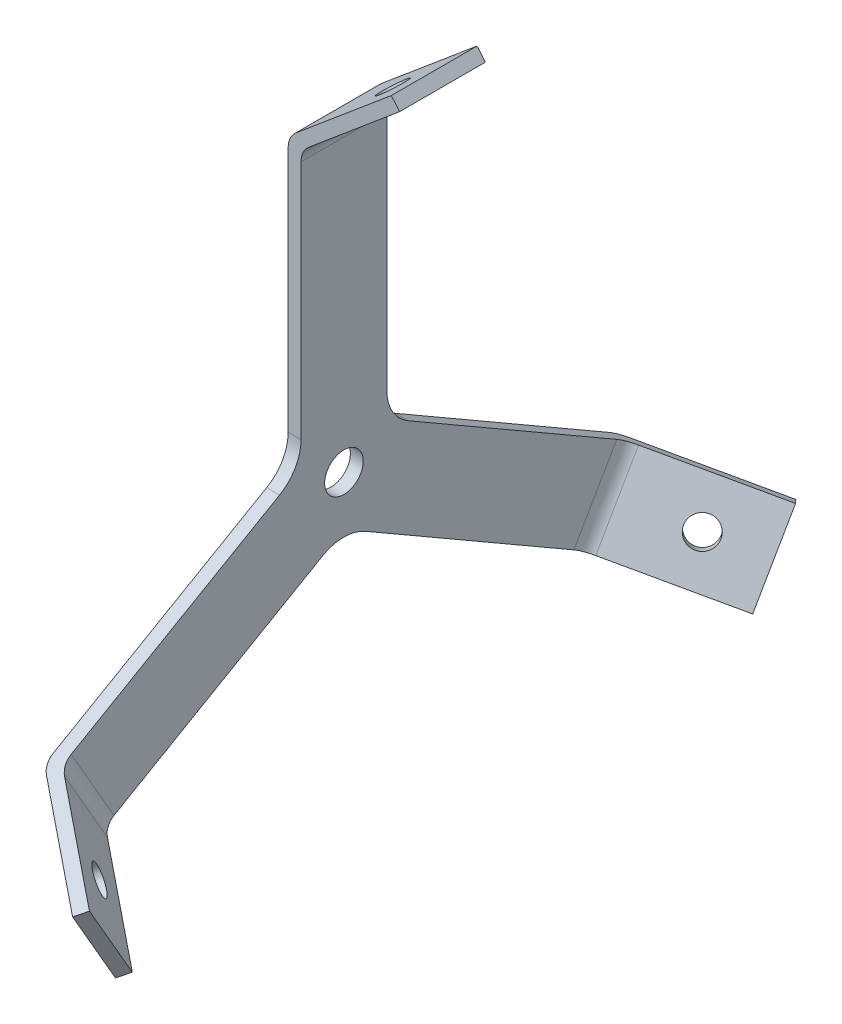
ISO-10303-21;
HEADER;
FILE_DESCRIPTION(('STEP AP214'),'2;1');
FILE_NAME('part.step','',(''),(''),'','','');
FILE_SCHEMA(('AUTOMOTIVE_DESIGN { 1 0 10303 214 1 1 1 1 }'));
ENDSEC;
DATA;
#1=APPLICATION_CONTEXT('core data for automotive mechanical design processes');
#2=APPLICATION_PROTOCOL_DEFINITION('international standard','automotive_design',2000,#1);
#3=PRODUCT_CONTEXT('',#1,'mechanical');
#4=PRODUCT('Part','Part','',(#3));
#5=PRODUCT_RELATED_PRODUCT_CATEGORY('part','',(#4));
#6=PRODUCT_DEFINITION_FORMATION('','',#4);
#7=PRODUCT_DEFINITION_CONTEXT('part definition',#1,'design');
#8=PRODUCT_DEFINITION('design','',#6,#7);
#9=PRODUCT_DEFINITION_SHAPE('','',#8);
#10=(LENGTH_UNIT() NAMED_UNIT(*) SI_UNIT(.MILLI.,.METRE.));
#11=(NAMED_UNIT(*) PLANE_ANGLE_UNIT() SI_UNIT($,.RADIAN.));
#12=(NAMED_UNIT(*) SI_UNIT($,.STERADIAN.) SOLID_ANGLE_UNIT());
#13=UNCERTAINTY_MEASURE_WITH_UNIT(LENGTH_MEASURE(1.E-05),#10,'distance_accuracy_value','');
#14=(GEOMETRIC_REPRESENTATION_CONTEXT(3) GLOBAL_UNCERTAINTY_ASSIGNED_CONTEXT((#13)) GLOBAL_UNIT_ASSIGNED_CONTEXT((#10,
#11,#12)) REPRESENTATION_CONTEXT('',''));
#15=CARTESIAN_POINT('',(0.,0.,0.));
#16=DIRECTION('',(0.,0.,1.));
#17=DIRECTION('',(1.,0.,0.));
#18=AXIS2_PLACEMENT_3D('',#15,#16,#17);
#19=CARTESIAN_POINT('',(5.,69.06738468369,-10.));
#20=DIRECTION('',(0.,0.,-1.));
#21=DIRECTION('',(-1.,0.,0.));
#22=AXIS2_PLACEMENT_3D('',#19,#20,#21);
#23=PLANE('',#22);
#24=DIRECTION('',(0.,1.,0.));
#25=VECTOR('',#24,1.);
#26=CARTESIAN_POINT('',(3.,67.668461709225,-10.));
#27=LINE('',#26,#25);
#28=CARTESIAN_POINT('',(3.,11.5470053837926,-10.));
#29=VERTEX_POINT('',#28);
#30=CARTESIAN_POINT('',(3.00000000000001,67.668461709225,-10.));
#31=VERTEX_POINT('',#30);
#32=EDGE_CURVE('E333',#29,#31,#27,.T.);
#33=ORIENTED_EDGE('',*,*,#32,.F.);
#34=DIRECTION('',(-1.,0.,0.));
#35=VECTOR('',#34,1.);
#36=CARTESIAN_POINT('',(5.,11.5470053837926,-10.));
#37=LINE('',#36,#35);
#38=CARTESIAN_POINT('',(0.,11.5470053837926,-10.));
#39=VERTEX_POINT('',#38);
#40=EDGE_CURVE('E371',#29,#39,#37,.T.);
#41=ORIENTED_EDGE('',*,*,#40,.T.);
#42=DIRECTION('',(0.,-1.,0.));
#43=VECTOR('',#42,1.);
#44=CARTESIAN_POINT('',(0.,0.,-10.));
#45=LINE('',#44,#43);
#46=CARTESIAN_POINT('',(0.,69.06738468369,-10.));
#47=VERTEX_POINT('',#46);
#48=EDGE_CURVE('E350',#47,#39,#45,.T.);
#49=ORIENTED_EDGE('',*,*,#48,.F.);
#50=CARTESIAN_POINT('',(5.,69.06738468369,-10.));
#51=DIRECTION('',(0.,0.,1.));
#52=DIRECTION('',(-1.,0.,0.));
#53=AXIS2_PLACEMENT_3D('',#50,#51,#52);
#54=CIRCLE('',#53,5.);
#55=CARTESIAN_POINT('',(1.78606195156731,72.8976068992849,-10.));
#56=VERTEX_POINT('',#55);
#57=EDGE_CURVE('E347',#56,#47,#54,.T.);
#58=ORIENTED_EDGE('',*,*,#57,.F.);
#59=DIRECTION('',(-0.766044443118979,-0.642787609686539,0.));
#60=VECTOR('',#59,1.);
#61=CARTESIAN_POINT('',(1.78606195156731,72.8976068992849,-10.));
#62=LINE('',#61,#60);
#63=CARTESIAN_POINT('',(24.0529704645097,91.5817616199531,-10.));
#64=VERTEX_POINT('',#63);
#65=EDGE_CURVE('E344',#64,#56,#62,.T.);
#66=ORIENTED_EDGE('',*,*,#65,.F.);
#67=DIRECTION('',(-0.642787609686536,0.766044443118981,0.));
#68=VECTOR('',#67,1.);
#69=CARTESIAN_POINT('',(24.0529704645097,91.5817616199531,-10.));
#70=LINE('',#69,#68);
#71=CARTESIAN_POINT('',(25.9813332935694,89.2836282905961,-10.));
#72=VERTEX_POINT('',#71);
#73=EDGE_CURVE('E341',#72,#64,#70,.T.);
#74=ORIENTED_EDGE('',*,*,#73,.F.);
#75=DIRECTION('',(0.766044443118979,0.642787609686538,0.));
#76=VECTOR('',#75,1.);
#77=CARTESIAN_POINT('',(25.9813332935694,89.2836282905961,-10.));
#78=LINE('',#77,#76);
#79=CARTESIAN_POINT('',(4.78606195156732,71.4986839248199,-10.));
#80=VERTEX_POINT('',#79);
#81=EDGE_CURVE('E338',#80,#72,#78,.T.);
#82=ORIENTED_EDGE('',*,*,#81,.F.);
#83=CARTESIAN_POINT('',(8.,67.668461709225,-10.));
#84=DIRECTION('',(0.,0.,-1.));
#85=DIRECTION('',(1.,0.,0.));
#86=AXIS2_PLACEMENT_3D('',#83,#84,#85);
#87=CIRCLE('',#86,4.99999999999999);
#88=EDGE_CURVE('E335',#31,#80,#87,.T.);
#89=ORIENTED_EDGE('',*,*,#88,.F.);
#90=EDGE_LOOP('',(#33,#41,#49,#58,#66,#74,#82,#89));
#91=FACE_BOUND('',#90,.T.);
#92=ADVANCED_FACE('F32',(#91),#23,.T.);
#93=CARTESIAN_POINT('',(0.,0.,-10.));
#94=DIRECTION('',(-1.,0.,0.));
#95=DIRECTION('',(0.,0.,1.));
#96=AXIS2_PLACEMENT_3D('',#93,#94,#95);
#97=PLANE('',#96);
#98=CARTESIAN_POINT('',(0.,0.,0.));
#99=DIRECTION('',(-1.,0.,0.));
#100=DIRECTION('',(0.,0.,1.));
#101=AXIS2_PLACEMENT_3D('',#98,#99,#100);
#102=CIRCLE('',#101,4.49999999999999);
#103=CARTESIAN_POINT('',(0.,0.,4.49999999999999));
#104=VERTEX_POINT('',#103);
#105=EDGE_CURVE('E389',#104,#104,#102,.T.);
#106=ORIENTED_EDGE('',*,*,#105,.F.);
#107=EDGE_LOOP('',(#106));
#108=FACE_BOUND('',#107,.T.);
#109=DIRECTION('',(0.,0.500000000000004,-0.866025403784436));
#110=VECTOR('',#109,1.);
#111=CARTESIAN_POINT('',(0.,8.66025403784437,5.00000000000004));
#112=LINE('',#111,#110);
#113=CARTESIAN_POINT('',(0.,-25.8734383040009,64.8141097090277));
#114=VERTEX_POINT('',#113);
#115=CARTESIAN_POINT('',(0.,2.88675134594809,15.));
#116=VERTEX_POINT('',#115);
#117=EDGE_CURVE('E298',#114,#116,#112,.T.);
#118=ORIENTED_EDGE('',*,*,#117,.T.);
#119=CARTESIAN_POINT('',(0.,11.5470053837924,20.));
#120=DIRECTION('',(-1.,0.,0.));
#121=DIRECTION('',(0.,0.,1.));
#122=AXIS2_PLACEMENT_3D('',#119,#120,#121);
#123=CIRCLE('',#122,10.);
#124=CARTESIAN_POINT('',(0.,11.5470053837924,10.));
#125=VERTEX_POINT('',#124);
#126=EDGE_CURVE('E11',#116,#125,#123,.F.);
#127=ORIENTED_EDGE('',*,*,#126,.T.);
#128=DIRECTION('',(0.,-1.,0.));
#129=VECTOR('',#128,1.);
#130=CARTESIAN_POINT('',(0.,0.,10.));
#131=LINE('',#130,#129);
#132=CARTESIAN_POINT('',(0.,69.06738468369,10.));
#133=VERTEX_POINT('',#132);
#134=EDGE_CURVE('E330',#133,#125,#131,.T.);
#135=ORIENTED_EDGE('',*,*,#134,.F.);
#136=DIRECTION('',(0.,0.,1.));
#137=VECTOR('',#136,1.);
#138=CARTESIAN_POINT('',(0.,69.06738468369,-10.));
#139=LINE('',#138,#137);
#140=EDGE_CURVE('E354',#47,#133,#139,.T.);
#141=ORIENTED_EDGE('',*,*,#140,.F.);
#142=ORIENTED_EDGE('',*,*,#48,.T.);
#143=CARTESIAN_POINT('',(0.,11.5470053837926,-20.));
#144=DIRECTION('',(-1.,0.,0.));
#145=DIRECTION('',(0.,0.,1.));
#146=AXIS2_PLACEMENT_3D('',#143,#144,#145);
#147=CIRCLE('',#146,10.);
#148=CARTESIAN_POINT('',(0.,2.88675134594821,-15.0000000000001));
#149=VERTEX_POINT('',#148);
#150=EDGE_CURVE('E383',#39,#149,#147,.F.);
#151=ORIENTED_EDGE('',*,*,#150,.T.);
#152=DIRECTION('',(0.,0.499999999999992,0.866025403784443));
#153=VECTOR('',#152,1.);
#154=CARTESIAN_POINT('',(0.,8.66025403784443,-4.99999999999992));
#155=LINE('',#154,#153);
#156=CARTESIAN_POINT('',(0.,-25.873438304,-64.814109709028));
#157=VERTEX_POINT('',#156);
#158=EDGE_CURVE('E233',#157,#149,#155,.T.);
#159=ORIENTED_EDGE('',*,*,#158,.F.);
#160=DIRECTION('',(0.,0.866025403784443,-0.499999999999992));
#161=VECTOR('',#160,1.);
#162=CARTESIAN_POINT('',(0.,-43.1939463796889,-54.8141097090282));
#163=LINE('',#162,#161);
#164=CARTESIAN_POINT('',(0.,-43.1939463796889,-54.8141097090282));
#165=VERTEX_POINT('',#164);
#166=EDGE_CURVE('E252',#165,#157,#163,.T.);
#167=ORIENTED_EDGE('',*,*,#166,.F.);
#168=DIRECTION('',(0.,0.499999999999992,0.866025403784443));
#169=VECTOR('',#168,1.);
#170=CARTESIAN_POINT('',(0.,-8.66025403784443,4.99999999999992));
#171=LINE('',#170,#169);
#172=CARTESIAN_POINT('',(0.,-14.4337567297406,-5.00000000000008));
#173=VERTEX_POINT('',#172);
#174=EDGE_CURVE('E216',#165,#173,#171,.T.);
#175=ORIENTED_EDGE('',*,*,#174,.T.);
#176=CARTESIAN_POINT('',(0.,-23.094010767585,-1.59594559789866E-13));
#177=DIRECTION('',(-1.,0.,0.));
#178=DIRECTION('',(0.,0.,1.));
#179=AXIS2_PLACEMENT_3D('',#176,#177,#178);
#180=CIRCLE('',#179,10.);
#181=CARTESIAN_POINT('',(0.,-14.4337567297406,4.99999999999989));
#182=VERTEX_POINT('',#181);
#183=EDGE_CURVE('E381',#173,#182,#180,.F.);
#184=ORIENTED_EDGE('',*,*,#183,.T.);
#185=DIRECTION('',(0.,0.500000000000004,-0.866025403784436));
#186=VECTOR('',#185,1.);
#187=CARTESIAN_POINT('',(0.,-8.66025403784436,-5.00000000000004));
#188=LINE('',#187,#186);
#189=CARTESIAN_POINT('',(0.,-43.1939463796896,54.8141097090276));
#190=VERTEX_POINT('',#189);
#191=EDGE_CURVE('E278',#190,#182,#188,.T.);
#192=ORIENTED_EDGE('',*,*,#191,.F.);
#193=DIRECTION('',(0.,-0.866025403784436,-0.500000000000004));
#194=VECTOR('',#193,1.);
#195=CARTESIAN_POINT('',(0.,-25.8734383040009,64.8141097090277));
#196=LINE('',#195,#194);
#197=EDGE_CURVE('E301',#114,#190,#196,.T.);
#198=ORIENTED_EDGE('',*,*,#197,.F.);
#199=EDGE_LOOP('',(#118,#127,#135,#141,#142,#151,#159,#167,#175,#184,#192,#198));
#200=FACE_BOUND('',#199,.T.);
#201=ADVANCED_FACE('F432',(#108,#200),#97,.T.);
#202=CARTESIAN_POINT('',(5.,69.06738468369,-10.));
#203=DIRECTION('',(0.,0.,1.));
#204=DIRECTION('',(1.,0.,0.));
#205=AXIS2_PLACEMENT_3D('',#202,#203,#204);
#206=CYLINDRICAL_SURFACE('',#205,5.);
#207=ORIENTED_EDGE('',*,*,#140,.T.);
#208=CARTESIAN_POINT('',(5.,69.06738468369,10.));
#209=DIRECTION('',(0.,0.,1.));
#210=DIRECTION('',(-1.,0.,0.));
#211=AXIS2_PLACEMENT_3D('',#208,#209,#210);
#212=CIRCLE('',#211,5.);
#213=CARTESIAN_POINT('',(1.78606195156731,72.8976068992849,10.));
#214=VERTEX_POINT('',#213);
#215=EDGE_CURVE('E327',#214,#133,#212,.T.);
#216=ORIENTED_EDGE('',*,*,#215,.F.);
#217=DIRECTION('',(0.,0.,1.));
#218=VECTOR('',#217,1.);
#219=CARTESIAN_POINT('',(1.78606195156731,72.8976068992849,-10.));
#220=LINE('',#219,#218);
#221=EDGE_CURVE('E357',#56,#214,#220,.T.);
#222=ORIENTED_EDGE('',*,*,#221,.F.);
#223=ORIENTED_EDGE('',*,*,#57,.T.);
#224=EDGE_LOOP('',(#207,#216,#222,#223));
#225=FACE_BOUND('',#224,.T.);
#226=ADVANCED_FACE('F488',(#225),#206,.T.);
#227=CARTESIAN_POINT('',(1.78606195156731,72.8976068992849,-10.));
#228=DIRECTION('',(-0.642787609686539,0.766044443118979,0.));
#229=DIRECTION('',(-0.766044443118979,-0.642787609686539,0.));
#230=AXIS2_PLACEMENT_3D('',#227,#228,#229);
#231=PLANE('',#230);
#232=CARTESIAN_POINT('',(14.3483657692924,83.4386313994749,0.));
#233=DIRECTION('',(-0.642787609686539,0.766044443118979,0.));
#234=DIRECTION('',(-0.766044443118979,-0.642787609686539,0.));
#235=AXIS2_PLACEMENT_3D('',#232,#233,#234);
#236=CIRCLE('',#235,3.3);
#237=CARTESIAN_POINT('',(11.8204191069998,81.3174322875093,0.));
#238=VERTEX_POINT('',#237);
#239=EDGE_CURVE('E390',#238,#238,#236,.T.);
#240=ORIENTED_EDGE('',*,*,#239,.F.);
#241=EDGE_LOOP('',(#240));
#242=FACE_BOUND('',#241,.T.);
#243=ORIENTED_EDGE('',*,*,#221,.T.);
#244=DIRECTION('',(-0.766044443118979,-0.642787609686539,0.));
#245=VECTOR('',#244,1.);
#246=CARTESIAN_POINT('',(1.78606195156731,72.8976068992849,10.));
#247=LINE('',#246,#245);
#248=CARTESIAN_POINT('',(24.0529704645097,91.5817616199531,10.));
#249=VERTEX_POINT('',#248);
#250=EDGE_CURVE('E324',#249,#214,#247,.T.);
#251=ORIENTED_EDGE('',*,*,#250,.F.);
#252=DIRECTION('',(0.,0.,1.));
#253=VECTOR('',#252,1.);
#254=CARTESIAN_POINT('',(24.0529704645097,91.5817616199531,-10.));
#255=LINE('',#254,#253);
#256=EDGE_CURVE('E359',#64,#249,#255,.T.);
#257=ORIENTED_EDGE('',*,*,#256,.F.);
#258=ORIENTED_EDGE('',*,*,#65,.T.);
#259=EDGE_LOOP('',(#243,#251,#257,#258));
#260=FACE_BOUND('',#259,.T.);
#261=ADVANCED_FACE('F483',(#242,#260),#231,.T.);
#262=CARTESIAN_POINT('',(24.0529704645097,91.5817616199531,-10.));
#263=DIRECTION('',(0.766044443118981,0.642787609686536,0.));
#264=DIRECTION('',(-0.642787609686536,0.766044443118981,0.));
#265=AXIS2_PLACEMENT_3D('',#262,#263,#264);
#266=PLANE('',#265);
#267=ORIENTED_EDGE('',*,*,#256,.T.);
#268=DIRECTION('',(-0.642787609686536,0.766044443118981,0.));
#269=VECTOR('',#268,1.);
#270=CARTESIAN_POINT('',(24.0529704645097,91.5817616199531,10.));
#271=LINE('',#270,#269);
#272=CARTESIAN_POINT('',(25.9813332935694,89.2836282905961,10.));
#273=VERTEX_POINT('',#272);
#274=EDGE_CURVE('E321',#273,#249,#271,.T.);
#275=ORIENTED_EDGE('',*,*,#274,.F.);
#276=DIRECTION('',(0.,0.,1.));
#277=VECTOR('',#276,1.);
#278=CARTESIAN_POINT('',(25.9813332935694,89.2836282905961,-10.));
#279=LINE('',#278,#277);
#280=EDGE_CURVE('E361',#72,#273,#279,.T.);
#281=ORIENTED_EDGE('',*,*,#280,.F.);
#282=ORIENTED_EDGE('',*,*,#73,.T.);
#283=EDGE_LOOP('',(#267,#275,#281,#282));
#284=FACE_BOUND('',#283,.T.);
#285=ADVANCED_FACE('F480',(#284),#266,.T.);
#286=CARTESIAN_POINT('',(25.9813332935694,89.2836282905961,-10.));
#287=DIRECTION('',(0.642787609686538,-0.766044443118979,0.));
#288=DIRECTION('',(0.766044443118979,0.642787609686538,0.));
#289=AXIS2_PLACEMENT_3D('',#286,#287,#288);
#290=PLANE('',#289);
#291=CARTESIAN_POINT('',(16.276728598352,81.140498070118,0.));
#292=DIRECTION('',(0.642787609686538,-0.766044443118979,0.));
#293=DIRECTION('',(0.766044443118979,0.642787609686538,0.));
#294=AXIS2_PLACEMENT_3D('',#291,#292,#293);
#295=CIRCLE('',#294,3.3);
#296=CARTESIAN_POINT('',(18.8046752606446,83.2616971820836,0.));
#297=VERTEX_POINT('',#296);
#298=EDGE_CURVE('E392',#297,#297,#295,.T.);
#299=ORIENTED_EDGE('',*,*,#298,.F.);
#300=EDGE_LOOP('',(#299));
#301=FACE_BOUND('',#300,.T.);
#302=ORIENTED_EDGE('',*,*,#280,.T.);
#303=DIRECTION('',(0.766044443118979,0.642787609686538,0.));
#304=VECTOR('',#303,1.);
#305=CARTESIAN_POINT('',(25.9813332935694,89.2836282905961,10.));
#306=LINE('',#305,#304);
#307=CARTESIAN_POINT('',(4.78606195156732,71.4986839248199,10.));
#308=VERTEX_POINT('',#307);
#309=EDGE_CURVE('E318',#308,#273,#306,.T.);
#310=ORIENTED_EDGE('',*,*,#309,.F.);
#311=DIRECTION('',(0.,0.,1.));
#312=VECTOR('',#311,1.);
#313=CARTESIAN_POINT('',(4.78606195156732,71.4986839248199,-10.));
#314=LINE('',#313,#312);
#315=EDGE_CURVE('E363',#80,#308,#314,.T.);
#316=ORIENTED_EDGE('',*,*,#315,.F.);
#317=ORIENTED_EDGE('',*,*,#81,.T.);
#318=EDGE_LOOP('',(#302,#310,#316,#317));
#319=FACE_BOUND('',#318,.T.);
#320=ADVANCED_FACE('F477',(#301,#319),#290,.T.);
#321=CARTESIAN_POINT('',(8.,67.668461709225,-10.));
#322=DIRECTION('',(0.,0.,1.));
#323=DIRECTION('',(1.,0.,0.));
#324=AXIS2_PLACEMENT_3D('',#321,#322,#323);
#325=CYLINDRICAL_SURFACE('',#324,4.99999999999999);
#326=ORIENTED_EDGE('',*,*,#315,.T.);
#327=CARTESIAN_POINT('',(8.,67.668461709225,10.));
#328=DIRECTION('',(0.,0.,-1.));
#329=DIRECTION('',(1.,0.,0.));
#330=AXIS2_PLACEMENT_3D('',#327,#328,#329);
#331=CIRCLE('',#330,4.99999999999999);
#332=CARTESIAN_POINT('',(3.00000000000001,67.668461709225,10.));
#333=VERTEX_POINT('',#332);
#334=EDGE_CURVE('E315',#333,#308,#331,.T.);
#335=ORIENTED_EDGE('',*,*,#334,.F.);
#336=DIRECTION('',(0.,0.,1.));
#337=VECTOR('',#336,1.);
#338=CARTESIAN_POINT('',(3.00000000000001,67.668461709225,-10.));
#339=LINE('',#338,#337);
#340=EDGE_CURVE('E353',#31,#333,#339,.T.);
#341=ORIENTED_EDGE('',*,*,#340,.F.);
#342=ORIENTED_EDGE('',*,*,#88,.T.);
#343=EDGE_LOOP('',(#326,#335,#341,#342));
#344=FACE_BOUND('',#343,.T.);
#345=ADVANCED_FACE('F471',(#344),#325,.F.);
#346=CARTESIAN_POINT('',(3.,67.668461709225,-10.));
#347=DIRECTION('',(1.,0.,0.));
#348=DIRECTION('',(0.,1.,0.));
#349=AXIS2_PLACEMENT_3D('',#346,#347,#348);
#350=PLANE('',#349);
#351=CARTESIAN_POINT('',(3.,0.,0.));
#352=DIRECTION('',(1.,0.,0.));
#353=DIRECTION('',(0.,1.,0.));
#354=AXIS2_PLACEMENT_3D('',#351,#352,#353);
#355=CIRCLE('',#354,4.49999999999999);
#356=CARTESIAN_POINT('',(3.,4.49999999999999,0.));
#357=VERTEX_POINT('',#356);
#358=EDGE_CURVE('E205',#357,#357,#355,.T.);
#359=ORIENTED_EDGE('',*,*,#358,.F.);
#360=EDGE_LOOP('',(#359));
#361=FACE_BOUND('',#360,.T.);
#362=DIRECTION('',(0.,1.,0.));
#363=VECTOR('',#362,1.);
#364=CARTESIAN_POINT('',(3.,67.668461709225,10.));
#365=LINE('',#364,#363);
#366=CARTESIAN_POINT('',(3.,11.5470053837924,10.));
#367=VERTEX_POINT('',#366);
#368=EDGE_CURVE('E303',#367,#333,#365,.T.);
#369=ORIENTED_EDGE('',*,*,#368,.F.);
#370=CARTESIAN_POINT('',(3.,11.5470053837924,20.));
#371=DIRECTION('',(1.,0.,0.));
#372=DIRECTION('',(0.,1.,0.));
#373=AXIS2_PLACEMENT_3D('',#370,#371,#372);
#374=CIRCLE('',#373,10.);
#375=CARTESIAN_POINT('',(3.,2.8867513459481,14.9999999999999));
#376=VERTEX_POINT('',#375);
#377=EDGE_CURVE('E41',#367,#376,#374,.F.);
#378=ORIENTED_EDGE('',*,*,#377,.T.);
#379=DIRECTION('',(0.,-0.500000000000004,0.866025403784436));
#380=VECTOR('',#379,1.);
#381=CARTESIAN_POINT('',(3.,-25.1739768167684,63.6026068752033));
#382=LINE('',#381,#380);
#383=CARTESIAN_POINT('',(3.00000000000001,-25.1739768167684,63.6026068752033));
#384=VERTEX_POINT('',#383);
#385=EDGE_CURVE('E281',#376,#384,#382,.T.);
#386=ORIENTED_EDGE('',*,*,#385,.T.);
#387=DIRECTION('',(0.,-0.866025403784436,-0.500000000000004));
#388=VECTOR('',#387,1.);
#389=CARTESIAN_POINT('',(3.00000000000001,-25.1739768167684,63.6026068752033));
#390=LINE('',#389,#388);
#391=CARTESIAN_POINT('',(3.00000000000001,-42.4944848924571,53.6026068752032));
#392=VERTEX_POINT('',#391);
#393=EDGE_CURVE('E300',#384,#392,#390,.T.);
#394=ORIENTED_EDGE('',*,*,#393,.T.);
#395=DIRECTION('',(0.,-0.500000000000004,0.866025403784436));
#396=VECTOR('',#395,1.);
#397=CARTESIAN_POINT('',(3.,-42.4944848924571,53.6026068752032));
#398=LINE('',#397,#396);
#399=CARTESIAN_POINT('',(3.,-14.4337567297406,4.99999999999987));
#400=VERTEX_POINT('',#399);
#401=EDGE_CURVE('E254',#400,#392,#398,.T.);
#402=ORIENTED_EDGE('',*,*,#401,.F.);
#403=CARTESIAN_POINT('',(3.,-23.094010767585,-1.59594559789866E-13));
#404=DIRECTION('',(1.,0.,0.));
#405=DIRECTION('',(0.,1.,0.));
#406=AXIS2_PLACEMENT_3D('',#403,#404,#405);
#407=CIRCLE('',#406,10.);
#408=CARTESIAN_POINT('',(3.,-14.4337567297406,-5.00000000000008));
#409=VERTEX_POINT('',#408);
#410=EDGE_CURVE('E379',#400,#409,#407,.F.);
#411=ORIENTED_EDGE('',*,*,#410,.T.);
#412=DIRECTION('',(0.,-0.499999999999992,-0.866025403784443));
#413=VECTOR('',#412,1.);
#414=CARTESIAN_POINT('',(3.,-42.4944848924564,-53.6026068752038));
#415=LINE('',#414,#413);
#416=CARTESIAN_POINT('',(3.00000000000001,-42.4944848924564,-53.6026068752038));
#417=VERTEX_POINT('',#416);
#418=EDGE_CURVE('E211',#409,#417,#415,.T.);
#419=ORIENTED_EDGE('',*,*,#418,.T.);
#420=DIRECTION('',(0.,0.866025403784443,-0.499999999999992));
#421=VECTOR('',#420,1.);
#422=CARTESIAN_POINT('',(3.00000000000001,-42.4944848924564,-53.6026068752038));
#423=LINE('',#422,#421);
#424=CARTESIAN_POINT('',(3.00000000000001,-25.1739768167675,-63.6026068752036));
#425=VERTEX_POINT('',#424);
#426=EDGE_CURVE('E208',#417,#425,#423,.T.);
#427=ORIENTED_EDGE('',*,*,#426,.T.);
#428=DIRECTION('',(0.,-0.499999999999992,-0.866025403784443));
#429=VECTOR('',#428,1.);
#430=CARTESIAN_POINT('',(3.,-25.1739768167675,-63.6026068752036));
#431=LINE('',#430,#429);
#432=CARTESIAN_POINT('',(3.,2.8867513459482,-15.0000000000001));
#433=VERTEX_POINT('',#432);
#434=EDGE_CURVE('E194',#433,#425,#431,.T.);
#435=ORIENTED_EDGE('',*,*,#434,.F.);
#436=CARTESIAN_POINT('',(3.,11.5470053837926,-20.));
#437=DIRECTION('',(1.,0.,0.));
#438=DIRECTION('',(0.,1.,0.));
#439=AXIS2_PLACEMENT_3D('',#436,#437,#438);
#440=CIRCLE('',#439,10.);
#441=EDGE_CURVE('E385',#433,#29,#440,.F.);
#442=ORIENTED_EDGE('',*,*,#441,.T.);
#443=ORIENTED_EDGE('',*,*,#32,.T.);
#444=ORIENTED_EDGE('',*,*,#340,.T.);
#445=EDGE_LOOP('',(#369,#378,#386,#394,#402,#411,#419,#427,#435,#442,#443,#444));
#446=FACE_BOUND('',#445,.T.);
#447=ADVANCED_FACE('F209',(#361,#446),#350,.T.);
#448=CARTESIAN_POINT('',(5.,69.06738468369,10.));
#449=DIRECTION('',(0.,0.,-1.));
#450=DIRECTION('',(-1.,0.,0.));
#451=AXIS2_PLACEMENT_3D('',#448,#449,#450);
#452=PLANE('',#451);
#453=ORIENTED_EDGE('',*,*,#134,.T.);
#454=DIRECTION('',(1.,0.,0.));
#455=VECTOR('',#454,1.);
#456=CARTESIAN_POINT('',(5.,11.5470053837924,10.));
#457=LINE('',#456,#455);
#458=EDGE_CURVE('E375',#125,#367,#457,.T.);
#459=ORIENTED_EDGE('',*,*,#458,.T.);
#460=ORIENTED_EDGE('',*,*,#368,.T.);
#461=ORIENTED_EDGE('',*,*,#334,.T.);
#462=ORIENTED_EDGE('',*,*,#309,.T.);
#463=ORIENTED_EDGE('',*,*,#274,.T.);
#464=ORIENTED_EDGE('',*,*,#250,.T.);
#465=ORIENTED_EDGE('',*,*,#215,.T.);
#466=EDGE_LOOP('',(#453,#459,#460,#461,#462,#463,#464,#465));
#467=FACE_BOUND('',#466,.T.);
#468=ADVANCED_FACE('F474',(#467),#452,.F.);
#469=CARTESIAN_POINT('',(5.,-25.8734383040009,64.8141097090277));
#470=DIRECTION('',(0.,0.866025403784436,0.500000000000004));
#471=DIRECTION('',(-1.,0.,0.));
#472=AXIS2_PLACEMENT_3D('',#469,#470,#471);
#473=PLANE('',#472);
#474=ORIENTED_EDGE('',*,*,#385,.F.);
#475=DIRECTION('',(1.,0.,0.));
#476=VECTOR('',#475,1.);
#477=CARTESIAN_POINT('',(5.,2.88675134594809,15.));
#478=LINE('',#477,#476);
#479=EDGE_CURVE('E55',#376,#116,#478,.F.);
#480=ORIENTED_EDGE('',*,*,#479,.T.);
#481=ORIENTED_EDGE('',*,*,#117,.F.);
#482=CARTESIAN_POINT('',(5.,-25.8734383040009,64.8141097090277));
#483=DIRECTION('',(0.,-0.866025403784436,-0.500000000000004));
#484=DIRECTION('',(-1.,0.,0.));
#485=AXIS2_PLACEMENT_3D('',#482,#483,#484);
#486=CIRCLE('',#485,5.);
#487=CARTESIAN_POINT('',(1.78606195156731,-27.7885494117984,68.1311794498724));
#488=VERTEX_POINT('',#487);
#489=EDGE_CURVE('E295',#488,#114,#486,.T.);
#490=ORIENTED_EDGE('',*,*,#489,.F.);
#491=DIRECTION('',(-0.766044443118979,0.321393804843272,-0.556670399226417));
#492=VECTOR('',#491,1.);
#493=CARTESIAN_POINT('',(1.78606195156731,-27.7885494117984,68.1311794498724));
#494=LINE('',#493,#492);
#495=CARTESIAN_POINT('',(24.0529704645097,-37.1306267721326,84.3121320862099));
#496=VERTEX_POINT('',#495);
#497=EDGE_CURVE('E292',#496,#488,#494,.T.);
#498=ORIENTED_EDGE('',*,*,#497,.F.);
#499=DIRECTION('',(-0.642787609686536,-0.383022221559494,0.663413948168939));
#500=VECTOR('',#499,1.);
#501=CARTESIAN_POINT('',(24.0529704645097,-37.1306267721326,84.3121320862099));
#502=LINE('',#501,#500);
#503=CARTESIAN_POINT('',(25.9813332935694,-35.9815601074541,82.3218902417031));
#504=VERTEX_POINT('',#503);
#505=EDGE_CURVE('E289',#504,#496,#502,.T.);
#506=ORIENTED_EDGE('',*,*,#505,.F.);
#507=DIRECTION('',(0.766044443118979,-0.321393804843272,0.556670399226417));
#508=VECTOR('',#507,1.);
#509=CARTESIAN_POINT('',(25.9813332935694,-35.9815601074541,82.3218902417031));
#510=LINE('',#509,#508);
#511=CARTESIAN_POINT('',(4.78606195156732,-27.0890879245659,66.919676616048));
#512=VERTEX_POINT('',#511);
#513=EDGE_CURVE('E286',#512,#504,#510,.T.);
#514=ORIENTED_EDGE('',*,*,#513,.F.);
#515=CARTESIAN_POINT('',(8.,-25.1739768167684,63.6026068752033));
#516=DIRECTION('',(0.,0.866025403784436,0.500000000000004));
#517=DIRECTION('',(1.,0.,0.));
#518=AXIS2_PLACEMENT_3D('',#515,#516,#517);
#519=CIRCLE('',#518,4.99999999999999);
#520=EDGE_CURVE('E283',#384,#512,#519,.T.);
#521=ORIENTED_EDGE('',*,*,#520,.F.);
#522=EDGE_LOOP('',(#474,#480,#481,#490,#498,#506,#514,#521));
#523=FACE_BOUND('',#522,.T.);
#524=ADVANCED_FACE('F551',(#523),#473,.T.);
#525=CARTESIAN_POINT('',(5.,-25.8734383040009,64.8141097090277));
#526=DIRECTION('',(0.,-0.866025403784436,-0.500000000000004));
#527=DIRECTION('',(0.,0.500000000000004,-0.866025403784436));
#528=AXIS2_PLACEMENT_3D('',#525,#526,#527);
#529=CYLINDRICAL_SURFACE('',#528,5.);
#530=ORIENTED_EDGE('',*,*,#197,.T.);
#531=CARTESIAN_POINT('',(5.,-43.1939463796896,54.8141097090276));
#532=DIRECTION('',(0.,-0.866025403784436,-0.500000000000004));
#533=DIRECTION('',(-1.,0.,0.));
#534=AXIS2_PLACEMENT_3D('',#531,#532,#533);
#535=CIRCLE('',#534,5.);
#536=CARTESIAN_POINT('',(1.78606195156731,-45.1090574874871,58.1311794498723));
#537=VERTEX_POINT('',#536);
#538=EDGE_CURVE('E275',#537,#190,#535,.T.);
#539=ORIENTED_EDGE('',*,*,#538,.F.);
#540=DIRECTION('',(0.,-0.866025403784436,-0.500000000000004));
#541=VECTOR('',#540,1.);
#542=CARTESIAN_POINT('',(1.78606195156731,-27.7885494117984,68.1311794498724));
#543=LINE('',#542,#541);
#544=EDGE_CURVE('E304',#488,#537,#543,.T.);
#545=ORIENTED_EDGE('',*,*,#544,.F.);
#546=ORIENTED_EDGE('',*,*,#489,.T.);
#547=EDGE_LOOP('',(#530,#539,#545,#546));
#548=FACE_BOUND('',#547,.T.);
#549=ADVANCED_FACE('F420',(#548),#529,.T.);
#550=CARTESIAN_POINT('',(1.78606195156731,-27.7885494117984,68.1311794498724));
#551=DIRECTION('',(-0.642787609686539,-0.383022221559492,0.663413948168937));
#552=DIRECTION('',(0.718183226839565,0.,0.695854045534198));
#553=AXIS2_PLACEMENT_3D('',#550,#551,#552);
#554=PLANE('',#553);
#555=CARTESIAN_POINT('',(14.3483657692924,-41.7193156997368,72.2599744489516));
#556=DIRECTION('',(-0.642787609686539,-0.383022221559492,0.663413948168937));
#557=DIRECTION('',(0.718183226839565,0.,0.695854045534198));
#558=AXIS2_PLACEMENT_3D('',#555,#556,#557);
#559=CIRCLE('',#558,3.3);
#560=CARTESIAN_POINT('',(16.7183704178629,-41.7193156997368,74.5562927992145));
#561=VERTEX_POINT('',#560);
#562=EDGE_CURVE('E36',#561,#561,#559,.T.);
#563=ORIENTED_EDGE('',*,*,#562,.F.);
#564=EDGE_LOOP('',(#563));
#565=FACE_BOUND('',#564,.T.);
#566=ORIENTED_EDGE('',*,*,#544,.T.);
#567=DIRECTION('',(-0.766044443118979,0.321393804843272,-0.556670399226417));
#568=VECTOR('',#567,1.);
#569=CARTESIAN_POINT('',(1.78606195156731,-45.1090574874871,58.1311794498723));
#570=LINE('',#569,#568);
#571=CARTESIAN_POINT('',(24.0529704645097,-54.4511348478213,74.3121320862098));
#572=VERTEX_POINT('',#571);
#573=EDGE_CURVE('E272',#572,#537,#570,.T.);
#574=ORIENTED_EDGE('',*,*,#573,.F.);
#575=DIRECTION('',(0.,-0.866025403784436,-0.500000000000004));
#576=VECTOR('',#575,1.);
#577=CARTESIAN_POINT('',(24.0529704645097,-37.1306267721326,84.3121320862099));
#578=LINE('',#577,#576);
#579=EDGE_CURVE('E306',#496,#572,#578,.T.);
#580=ORIENTED_EDGE('',*,*,#579,.F.);
#581=ORIENTED_EDGE('',*,*,#497,.T.);
#582=EDGE_LOOP('',(#566,#574,#580,#581));
#583=FACE_BOUND('',#582,.T.);
#584=ADVANCED_FACE('F416',(#565,#583),#554,.T.);
#585=CARTESIAN_POINT('',(24.0529704645097,-37.1306267721326,84.3121320862099));
#586=DIRECTION('',(0.766044443118981,-0.321393804843271,0.556670399226415));
#587=DIRECTION('',(0.587858883152551,0.,-0.808963493304016));
#588=AXIS2_PLACEMENT_3D('',#585,#586,#587);
#589=PLANE('',#588);
#590=ORIENTED_EDGE('',*,*,#579,.T.);
#591=DIRECTION('',(-0.642787609686536,-0.383022221559494,0.663413948168939));
#592=VECTOR('',#591,1.);
#593=CARTESIAN_POINT('',(24.0529704645097,-54.4511348478213,74.3121320862098));
#594=LINE('',#593,#592);
#595=CARTESIAN_POINT('',(25.9813332935694,-53.3020681831428,72.321890241703));
#596=VERTEX_POINT('',#595);
#597=EDGE_CURVE('E269',#596,#572,#594,.T.);
#598=ORIENTED_EDGE('',*,*,#597,.F.);
#599=DIRECTION('',(0.,-0.866025403784436,-0.500000000000004));
#600=VECTOR('',#599,1.);
#601=CARTESIAN_POINT('',(25.9813332935694,-35.9815601074541,82.3218902417031));
#602=LINE('',#601,#600);
#603=EDGE_CURVE('E308',#504,#596,#602,.T.);
#604=ORIENTED_EDGE('',*,*,#603,.F.);
#605=ORIENTED_EDGE('',*,*,#505,.T.);
#606=EDGE_LOOP('',(#590,#598,#604,#605));
#607=FACE_BOUND('',#606,.T.);
#608=ADVANCED_FACE('F419',(#607),#589,.T.);
#609=CARTESIAN_POINT('',(25.9813332935694,-35.9815601074541,82.3218902417031));
#610=DIRECTION('',(0.642787609686538,0.383022221559493,-0.663413948168938));
#611=DIRECTION('',(-0.718183226839566,0.,-0.695854045534197));
#612=AXIS2_PLACEMENT_3D('',#609,#610,#611);
#613=PLANE('',#612);
#614=CARTESIAN_POINT('',(16.276728598352,-40.5702490350583,70.2697326044448));
#615=DIRECTION('',(0.642787609686538,0.383022221559483,-0.663413948168943));
#616=DIRECTION('',(-0.718183226839569,0.,-0.695854045534194));
#617=AXIS2_PLACEMENT_3D('',#614,#615,#616);
#618=CIRCLE('',#617,3.29999999999999);
#619=CARTESIAN_POINT('',(13.9067239497814,-40.5702490350583,67.9734142541819));
#620=VERTEX_POINT('',#619);
#621=EDGE_CURVE('E407',#620,#620,#618,.T.);
#622=ORIENTED_EDGE('',*,*,#621,.F.);
#623=EDGE_LOOP('',(#622));
#624=FACE_BOUND('',#623,.T.);
#625=ORIENTED_EDGE('',*,*,#603,.T.);
#626=DIRECTION('',(0.766044443118979,-0.321393804843272,0.556670399226417));
#627=VECTOR('',#626,1.);
#628=CARTESIAN_POINT('',(25.9813332935694,-53.3020681831428,72.321890241703));
#629=LINE('',#628,#627);
#630=CARTESIAN_POINT('',(4.78606195156732,-44.4095960002546,56.9196766160479));
#631=VERTEX_POINT('',#630);
#632=EDGE_CURVE('E266',#631,#596,#629,.T.);
#633=ORIENTED_EDGE('',*,*,#632,.F.);
#634=DIRECTION('',(0.,-0.866025403784436,-0.500000000000004));
#635=VECTOR('',#634,1.);
#636=CARTESIAN_POINT('',(4.78606195156732,-27.0890879245659,66.919676616048));
#637=LINE('',#636,#635);
#638=EDGE_CURVE('E310',#512,#631,#637,.T.);
#639=ORIENTED_EDGE('',*,*,#638,.F.);
#640=ORIENTED_EDGE('',*,*,#513,.T.);
#641=EDGE_LOOP('',(#625,#633,#639,#640));
#642=FACE_BOUND('',#641,.T.);
#643=ADVANCED_FACE('F558',(#624,#642),#613,.T.);
#644=CARTESIAN_POINT('',(8.,-25.1739768167684,63.6026068752033));
#645=DIRECTION('',(0.,-0.866025403784436,-0.500000000000004));
#646=DIRECTION('',(0.,0.500000000000004,-0.866025403784436));
#647=AXIS2_PLACEMENT_3D('',#644,#645,#646);
#648=CYLINDRICAL_SURFACE('',#647,4.99999999999999);
#649=ORIENTED_EDGE('',*,*,#638,.T.);
#650=CARTESIAN_POINT('',(8.,-42.4944848924571,53.6026068752032));
#651=DIRECTION('',(0.,0.866025403784436,0.500000000000004));
#652=DIRECTION('',(1.,0.,0.));
#653=AXIS2_PLACEMENT_3D('',#650,#651,#652);
#654=CIRCLE('',#653,4.99999999999999);
#655=EDGE_CURVE('E263',#392,#631,#654,.T.);
#656=ORIENTED_EDGE('',*,*,#655,.F.);
#657=ORIENTED_EDGE('',*,*,#393,.F.);
#658=ORIENTED_EDGE('',*,*,#520,.T.);
#659=EDGE_LOOP('',(#649,#656,#657,#658));
#660=FACE_BOUND('',#659,.T.);
#661=ADVANCED_FACE('F550',(#660),#648,.F.);
#662=CARTESIAN_POINT('',(5.,-43.1939463796896,54.8141097090276));
#663=DIRECTION('',(0.,0.866025403784436,0.500000000000004));
#664=DIRECTION('',(-1.,0.,0.));
#665=AXIS2_PLACEMENT_3D('',#662,#663,#664);
#666=PLANE('',#665);
#667=ORIENTED_EDGE('',*,*,#191,.T.);
#668=DIRECTION('',(1.,0.,0.));
#669=VECTOR('',#668,1.);
#670=CARTESIAN_POINT('',(5.,-14.4337567297406,4.99999999999989));
#671=LINE('',#670,#669);
#672=EDGE_CURVE('E356',#182,#400,#671,.T.);
#673=ORIENTED_EDGE('',*,*,#672,.T.);
#674=ORIENTED_EDGE('',*,*,#401,.T.);
#675=ORIENTED_EDGE('',*,*,#655,.T.);
#676=ORIENTED_EDGE('',*,*,#632,.T.);
#677=ORIENTED_EDGE('',*,*,#597,.T.);
#678=ORIENTED_EDGE('',*,*,#573,.T.);
#679=ORIENTED_EDGE('',*,*,#538,.T.);
#680=EDGE_LOOP('',(#667,#673,#674,#675,#676,#677,#678,#679));
#681=FACE_BOUND('',#680,.T.);
#682=ADVANCED_FACE('F428',(#681),#666,.F.);
#683=CARTESIAN_POINT('',(5.,-43.1939463796889,-54.8141097090282));
#684=DIRECTION('',(0.,-0.866025403784443,0.499999999999992));
#685=DIRECTION('',(-1.,0.,0.));
#686=AXIS2_PLACEMENT_3D('',#683,#684,#685);
#687=PLANE('',#686);
#688=ORIENTED_EDGE('',*,*,#418,.F.);
#689=DIRECTION('',(1.,0.,0.));
#690=VECTOR('',#689,1.);
#691=CARTESIAN_POINT('',(5.,-14.4337567297406,-5.00000000000008));
#692=LINE('',#691,#690);
#693=EDGE_CURVE('E369',#409,#173,#692,.F.);
#694=ORIENTED_EDGE('',*,*,#693,.T.);
#695=ORIENTED_EDGE('',*,*,#174,.F.);
#696=CARTESIAN_POINT('',(5.,-43.1939463796889,-54.8141097090282));
#697=DIRECTION('',(0.,0.866025403784443,-0.499999999999992));
#698=DIRECTION('',(-1.,0.,0.));
#699=AXIS2_PLACEMENT_3D('',#696,#697,#698);
#700=CIRCLE('',#699,5.);
#701=CARTESIAN_POINT('',(1.78606195156731,-45.1090574874863,-58.1311794498729));
#702=VERTEX_POINT('',#701);
#703=EDGE_CURVE('E247',#702,#165,#700,.T.);
#704=ORIENTED_EDGE('',*,*,#703,.F.);
#705=DIRECTION('',(-0.766044443118979,0.321393804843264,0.556670399226422));
#706=VECTOR('',#705,1.);
#707=CARTESIAN_POINT('',(1.78606195156731,-45.1090574874863,-58.1311794498729));
#708=LINE('',#707,#706);
#709=CARTESIAN_POINT('',(24.0529704645097,-54.4511348478202,-74.3121320862106));
#710=VERTEX_POINT('',#709);
#711=EDGE_CURVE('E244',#710,#702,#708,.T.);
#712=ORIENTED_EDGE('',*,*,#711,.F.);
#713=DIRECTION('',(-0.642787609686536,-0.383022221559484,-0.663413948168944));
#714=VECTOR('',#713,1.);
#715=CARTESIAN_POINT('',(24.0529704645097,-54.4511348478202,-74.3121320862106));
#716=LINE('',#715,#714);
#717=CARTESIAN_POINT('',(25.9813332935694,-53.3020681831418,-72.3218902417037));
#718=VERTEX_POINT('',#717);
#719=EDGE_CURVE('E241',#718,#710,#716,.T.);
#720=ORIENTED_EDGE('',*,*,#719,.F.);
#721=DIRECTION('',(0.766044443118979,-0.321393804843264,-0.556670399226421));
#722=VECTOR('',#721,1.);
#723=CARTESIAN_POINT('',(25.9813332935694,-53.3020681831418,-72.3218902417037));
#724=LINE('',#723,#722);
#725=CARTESIAN_POINT('',(4.78606195156732,-44.4095960002538,-56.9196766160485));
#726=VERTEX_POINT('',#725);
#727=EDGE_CURVE('E238',#726,#718,#724,.T.);
#728=ORIENTED_EDGE('',*,*,#727,.F.);
#729=CARTESIAN_POINT('',(8.,-42.4944848924564,-53.6026068752038));
#730=DIRECTION('',(0.,-0.866025403784443,0.499999999999992));
#731=DIRECTION('',(1.,0.,0.));
#732=AXIS2_PLACEMENT_3D('',#729,#730,#731);
#733=CIRCLE('',#732,4.99999999999999);
#734=EDGE_CURVE('E236',#417,#726,#733,.T.);
#735=ORIENTED_EDGE('',*,*,#734,.F.);
#736=EDGE_LOOP('',(#688,#694,#695,#704,#712,#720,#728,#735));
#737=FACE_BOUND('',#736,.T.);
#738=ADVANCED_FACE('F441',(#737),#687,.T.);
#739=CARTESIAN_POINT('',(5.,-43.1939463796889,-54.8141097090282));
#740=DIRECTION('',(0.,0.866025403784443,-0.499999999999992));
#741=DIRECTION('',(0.,0.499999999999992,0.866025403784443));
#742=AXIS2_PLACEMENT_3D('',#739,#740,#741);
#743=CYLINDRICAL_SURFACE('',#742,5.);
#744=ORIENTED_EDGE('',*,*,#166,.T.);
#745=CARTESIAN_POINT('',(5.,-25.873438304,-64.814109709028));
#746=DIRECTION('',(0.,0.866025403784443,-0.499999999999992));
#747=DIRECTION('',(-1.,0.,0.));
#748=AXIS2_PLACEMENT_3D('',#745,#746,#747);
#749=CIRCLE('',#748,5.);
#750=CARTESIAN_POINT('',(1.78606195156731,-27.7885494117974,-68.1311794498727));
#751=VERTEX_POINT('',#750);
#752=EDGE_CURVE('E230',#751,#157,#749,.T.);
#753=ORIENTED_EDGE('',*,*,#752,.F.);
#754=DIRECTION('',(0.,0.866025403784443,-0.499999999999992));
#755=VECTOR('',#754,1.);
#756=CARTESIAN_POINT('',(1.78606195156731,-45.1090574874863,-58.1311794498729));
#757=LINE('',#756,#755);
#758=EDGE_CURVE('E255',#702,#751,#757,.T.);
#759=ORIENTED_EDGE('',*,*,#758,.F.);
#760=ORIENTED_EDGE('',*,*,#703,.T.);
#761=EDGE_LOOP('',(#744,#753,#759,#760));
#762=FACE_BOUND('',#761,.T.);
#763=ADVANCED_FACE('F456',(#762),#743,.T.);
#764=CARTESIAN_POINT('',(1.78606195156731,-45.1090574874863,-58.1311794498729));
#765=DIRECTION('',(-0.642787609686539,-0.383022221559483,-0.663413948168943));
#766=DIRECTION('',(-0.718183226839568,0.,0.695854045534195));
#767=AXIS2_PLACEMENT_3D('',#764,#765,#766);
#768=PLANE('',#767);
#769=CARTESIAN_POINT('',(14.3483657692924,-41.7193156997378,-72.259974448951));
#770=DIRECTION('',(-0.642787609686539,-0.383022221559483,-0.663413948168943));
#771=DIRECTION('',(-0.718183226839568,0.,0.695854045534195));
#772=AXIS2_PLACEMENT_3D('',#769,#770,#771);
#773=CIRCLE('',#772,3.29999999999999);
#774=CARTESIAN_POINT('',(11.9783611207218,-41.7193156997378,-69.9636560986882));
#775=VERTEX_POINT('',#774);
#776=EDGE_CURVE('E397',#775,#775,#773,.T.);
#777=ORIENTED_EDGE('',*,*,#776,.F.);
#778=EDGE_LOOP('',(#777));
#779=FACE_BOUND('',#778,.T.);
#780=ORIENTED_EDGE('',*,*,#758,.T.);
#781=DIRECTION('',(-0.766044443118979,0.321393804843264,0.556670399226422));
#782=VECTOR('',#781,1.);
#783=CARTESIAN_POINT('',(1.78606195156731,-27.7885494117974,-68.1311794498727));
#784=LINE('',#783,#782);
#785=CARTESIAN_POINT('',(24.0529704645097,-37.1306267721314,-84.3121320862104));
#786=VERTEX_POINT('',#785);
#787=EDGE_CURVE('E227',#786,#751,#784,.T.);
#788=ORIENTED_EDGE('',*,*,#787,.F.);
#789=DIRECTION('',(0.,0.866025403784443,-0.499999999999992));
#790=VECTOR('',#789,1.);
#791=CARTESIAN_POINT('',(24.0529704645097,-54.4511348478202,-74.3121320862106));
#792=LINE('',#791,#790);
#793=EDGE_CURVE('E257',#710,#786,#792,.T.);
#794=ORIENTED_EDGE('',*,*,#793,.F.);
#795=ORIENTED_EDGE('',*,*,#711,.T.);
#796=EDGE_LOOP('',(#780,#788,#794,#795));
#797=FACE_BOUND('',#796,.T.);
#798=ADVANCED_FACE('F453',(#779,#797),#768,.T.);
#799=CARTESIAN_POINT('',(24.0529704645097,-54.4511348478202,-74.3121320862106));
#800=DIRECTION('',(0.766044443118981,-0.321393804843263,-0.55667039922642));
#801=DIRECTION('',(-0.587858883152554,0.,-0.808963493304013));
#802=AXIS2_PLACEMENT_3D('',#799,#800,#801);
#803=PLANE('',#802);
#804=ORIENTED_EDGE('',*,*,#793,.T.);
#805=DIRECTION('',(-0.642787609686536,-0.383022221559484,-0.663413948168944));
#806=VECTOR('',#805,1.);
#807=CARTESIAN_POINT('',(24.0529704645097,-37.1306267721314,-84.3121320862104));
#808=LINE('',#807,#806);
#809=CARTESIAN_POINT('',(25.9813332935694,-35.9815601074529,-82.3218902417036));
#810=VERTEX_POINT('',#809);
#811=EDGE_CURVE('E221',#810,#786,#808,.T.);
#812=ORIENTED_EDGE('',*,*,#811,.F.);
#813=DIRECTION('',(0.,0.866025403784443,-0.499999999999992));
#814=VECTOR('',#813,1.);
#815=CARTESIAN_POINT('',(25.9813332935694,-53.3020681831418,-72.3218902417037));
#816=LINE('',#815,#814);
#817=EDGE_CURVE('E259',#718,#810,#816,.T.);
#818=ORIENTED_EDGE('',*,*,#817,.F.);
#819=ORIENTED_EDGE('',*,*,#719,.T.);
#820=EDGE_LOOP('',(#804,#812,#818,#819));
#821=FACE_BOUND('',#820,.T.);
#822=ADVANCED_FACE('F451',(#821),#803,.T.);
#823=CARTESIAN_POINT('',(25.9813332935694,-53.3020681831418,-72.3218902417037));
#824=DIRECTION('',(0.642787609686538,0.383022221559483,0.663413948168943));
#825=DIRECTION('',(0.718183226839569,0.,-0.695854045534194));
#826=AXIS2_PLACEMENT_3D('',#823,#824,#825);
#827=PLANE('',#826);
#828=CARTESIAN_POINT('',(16.276728598352,-40.5702490350593,-70.2697326044442));
#829=DIRECTION('',(0.642787609686538,0.383022221559493,0.663413948168938));
#830=DIRECTION('',(0.718183226839566,0.,-0.695854045534197));
#831=AXIS2_PLACEMENT_3D('',#828,#829,#830);
#832=CIRCLE('',#831,3.29999999999999);
#833=CARTESIAN_POINT('',(18.6467332469226,-40.5702490350593,-72.566050954707));
#834=VERTEX_POINT('',#833);
#835=EDGE_CURVE('E402',#834,#834,#832,.T.);
#836=ORIENTED_EDGE('',*,*,#835,.F.);
#837=EDGE_LOOP('',(#836));
#838=FACE_BOUND('',#837,.T.);
#839=ORIENTED_EDGE('',*,*,#817,.T.);
#840=DIRECTION('',(0.766044443118979,-0.321393804843264,-0.556670399226421));
#841=VECTOR('',#840,1.);
#842=CARTESIAN_POINT('',(25.9813332935694,-35.9815601074529,-82.3218902417036));
#843=LINE('',#842,#841);
#844=CARTESIAN_POINT('',(4.78606195156732,-27.0890879245649,-66.9196766160483));
#845=VERTEX_POINT('',#844);
#846=EDGE_CURVE('E219',#845,#810,#843,.T.);
#847=ORIENTED_EDGE('',*,*,#846,.F.);
#848=DIRECTION('',(0.,0.866025403784443,-0.499999999999992));
#849=VECTOR('',#848,1.);
#850=CARTESIAN_POINT('',(4.78606195156732,-44.4095960002538,-56.9196766160485));
#851=LINE('',#850,#849);
#852=EDGE_CURVE('E215',#726,#845,#851,.T.);
#853=ORIENTED_EDGE('',*,*,#852,.F.);
#854=ORIENTED_EDGE('',*,*,#727,.T.);
#855=EDGE_LOOP('',(#839,#847,#853,#854));
#856=FACE_BOUND('',#855,.T.);
#857=ADVANCED_FACE('F447',(#838,#856),#827,.T.);
#858=CARTESIAN_POINT('',(8.,-42.4944848924564,-53.6026068752038));
#859=DIRECTION('',(0.,0.866025403784443,-0.499999999999992));
#860=DIRECTION('',(0.,0.499999999999992,0.866025403784443));
#861=AXIS2_PLACEMENT_3D('',#858,#859,#860);
#862=CYLINDRICAL_SURFACE('',#861,4.99999999999999);
#863=ORIENTED_EDGE('',*,*,#852,.T.);
#864=CARTESIAN_POINT('',(8.,-25.1739768167675,-63.6026068752036));
#865=DIRECTION('',(0.,-0.866025403784443,0.499999999999992));
#866=DIRECTION('',(1.,0.,0.));
#867=AXIS2_PLACEMENT_3D('',#864,#865,#866);
#868=CIRCLE('',#867,4.99999999999999);
#869=EDGE_CURVE('E200',#425,#845,#868,.T.);
#870=ORIENTED_EDGE('',*,*,#869,.F.);
#871=ORIENTED_EDGE('',*,*,#426,.F.);
#872=ORIENTED_EDGE('',*,*,#734,.T.);
#873=EDGE_LOOP('',(#863,#870,#871,#872));
#874=FACE_BOUND('',#873,.T.);
#875=ADVANCED_FACE('F218',(#874),#862,.F.);
#876=CARTESIAN_POINT('',(5.,-25.873438304,-64.814109709028));
#877=DIRECTION('',(0.,-0.866025403784443,0.499999999999992));
#878=DIRECTION('',(-1.,0.,0.));
#879=AXIS2_PLACEMENT_3D('',#876,#877,#878);
#880=PLANE('',#879);
#881=ORIENTED_EDGE('',*,*,#158,.T.);
#882=DIRECTION('',(-1.,0.,0.));
#883=VECTOR('',#882,1.);
#884=CARTESIAN_POINT('',(5.,2.8867513459482,-15.0000000000001));
#885=LINE('',#884,#883);
#886=EDGE_CURVE('E203',#149,#433,#885,.F.);
#887=ORIENTED_EDGE('',*,*,#886,.T.);
#888=ORIENTED_EDGE('',*,*,#434,.T.);
#889=ORIENTED_EDGE('',*,*,#869,.T.);
#890=ORIENTED_EDGE('',*,*,#846,.T.);
#891=ORIENTED_EDGE('',*,*,#811,.T.);
#892=ORIENTED_EDGE('',*,*,#787,.T.);
#893=ORIENTED_EDGE('',*,*,#752,.T.);
#894=EDGE_LOOP('',(#881,#887,#888,#889,#890,#891,#892,#893));
#895=FACE_BOUND('',#894,.T.);
#896=ADVANCED_FACE('F197',(#895),#880,.F.);
#897=CARTESIAN_POINT('',(5.,-23.094010767585,-1.59594559789866E-13));
#898=DIRECTION('',(1.,0.,0.));
#899=DIRECTION('',(0.,0.,-1.));
#900=AXIS2_PLACEMENT_3D('',#897,#898,#899);
#901=CYLINDRICAL_SURFACE('',#900,10.);
#902=ORIENTED_EDGE('',*,*,#183,.F.);
#903=ORIENTED_EDGE('',*,*,#693,.F.);
#904=ORIENTED_EDGE('',*,*,#410,.F.);
#905=ORIENTED_EDGE('',*,*,#672,.F.);
#906=EDGE_LOOP('',(#902,#903,#904,#905));
#907=FACE_BOUND('',#906,.T.);
#908=ADVANCED_FACE('F438',(#907),#901,.F.);
#909=CARTESIAN_POINT('',(5.,11.5470053837926,-20.));
#910=DIRECTION('',(-1.,0.,0.));
#911=DIRECTION('',(0.,0.,1.));
#912=AXIS2_PLACEMENT_3D('',#909,#910,#911);
#913=CYLINDRICAL_SURFACE('',#912,10.);
#914=ORIENTED_EDGE('',*,*,#441,.F.);
#915=ORIENTED_EDGE('',*,*,#886,.F.);
#916=ORIENTED_EDGE('',*,*,#150,.F.);
#917=ORIENTED_EDGE('',*,*,#40,.F.);
#918=EDGE_LOOP('',(#914,#915,#916,#917));
#919=FACE_BOUND('',#918,.T.);
#920=ADVANCED_FACE('F462',(#919),#913,.F.);
#921=CARTESIAN_POINT('',(5.,11.5470053837924,20.));
#922=DIRECTION('',(1.,0.,0.));
#923=DIRECTION('',(0.,0.,-1.));
#924=AXIS2_PLACEMENT_3D('',#921,#922,#923);
#925=CYLINDRICAL_SURFACE('',#924,10.);
#926=ORIENTED_EDGE('',*,*,#126,.F.);
#927=ORIENTED_EDGE('',*,*,#479,.F.);
#928=ORIENTED_EDGE('',*,*,#377,.F.);
#929=ORIENTED_EDGE('',*,*,#458,.F.);
#930=EDGE_LOOP('',(#926,#927,#928,#929));
#931=FACE_BOUND('',#930,.T.);
#932=ADVANCED_FACE('F34',(#931),#925,.F.);
#933=CARTESIAN_POINT('',(0.,0.,0.));
#934=DIRECTION('',(-1.,0.,0.));
#935=DIRECTION('',(0.,0.,1.));
#936=AXIS2_PLACEMENT_3D('',#933,#934,#935);
#937=CYLINDRICAL_SURFACE('',#936,4.49999999999999);
#938=ORIENTED_EDGE('',*,*,#358,.T.);
#939=EDGE_LOOP('',(#938));
#940=FACE_BOUND('',#939,.T.);
#941=ORIENTED_EDGE('',*,*,#105,.T.);
#942=EDGE_LOOP('',(#941));
#943=FACE_BOUND('',#942,.T.);
#944=ADVANCED_FACE('F492',(#940,#943),#937,.F.);
#945=CARTESIAN_POINT('',(16.276728598352,81.140498070118,0.));
#946=DIRECTION('',(0.642787609686538,-0.766044443118979,0.));
#947=DIRECTION('',(0.766044443118979,0.642787609686538,0.));
#948=AXIS2_PLACEMENT_3D('',#945,#946,#947);
#949=CYLINDRICAL_SURFACE('',#948,3.3);
#950=ORIENTED_EDGE('',*,*,#239,.T.);
#951=EDGE_LOOP('',(#950));
#952=FACE_BOUND('',#951,.T.);
#953=ORIENTED_EDGE('',*,*,#298,.T.);
#954=EDGE_LOOP('',(#953));
#955=FACE_BOUND('',#954,.T.);
#956=ADVANCED_FACE('F497',(#952,#955),#949,.F.);
#957=CARTESIAN_POINT('',(16.276728598352,-40.5702490350593,-70.2697326044442));
#958=DIRECTION('',(0.642787609686538,0.383022221559493,0.663413948168938));
#959=DIRECTION('',(0.718183226839566,0.,-0.695854045534197));
#960=AXIS2_PLACEMENT_3D('',#957,#958,#959);
#961=CYLINDRICAL_SURFACE('',#960,3.29999999999999);
#962=ORIENTED_EDGE('',*,*,#776,.T.);
#963=EDGE_LOOP('',(#962));
#964=FACE_BOUND('',#963,.T.);
#965=ORIENTED_EDGE('',*,*,#835,.T.);
#966=EDGE_LOOP('',(#965));
#967=FACE_BOUND('',#966,.T.);
#968=ADVANCED_FACE('F671',(#964,#967),#961,.F.);
#969=CARTESIAN_POINT('',(16.276728598352,-40.5702490350583,70.2697326044448));
#970=DIRECTION('',(0.642787609686538,0.383022221559483,-0.663413948168943));
#971=DIRECTION('',(-0.718183226839569,0.,-0.695854045534194));
#972=AXIS2_PLACEMENT_3D('',#969,#970,#971);
#973=CYLINDRICAL_SURFACE('',#972,3.3);
#974=ORIENTED_EDGE('',*,*,#562,.T.);
#975=EDGE_LOOP('',(#974));
#976=FACE_BOUND('',#975,.T.);
#977=ORIENTED_EDGE('',*,*,#621,.T.);
#978=EDGE_LOOP('',(#977));
#979=FACE_BOUND('',#978,.T.);
#980=ADVANCED_FACE('F414',(#976,#979),#973,.F.);
#981=CLOSED_SHELL('',(#92,#201,#226,#261,#285,#320,#345,#447,#468,#524,#549,#584,#608,#643,#661,
#682,#738,#763,#798,#822,#857,#875,#896,#908,#920,#932,#944,#956,#968,#980));
#982=MANIFOLD_SOLID_BREP('B2',#981);
#983=ADVANCED_BREP_SHAPE_REPRESENTATION('',(#18,#982),#14);
#984=SHAPE_DEFINITION_REPRESENTATION(#9,#983);
ENDSEC;
END-ISO-10303-21;
